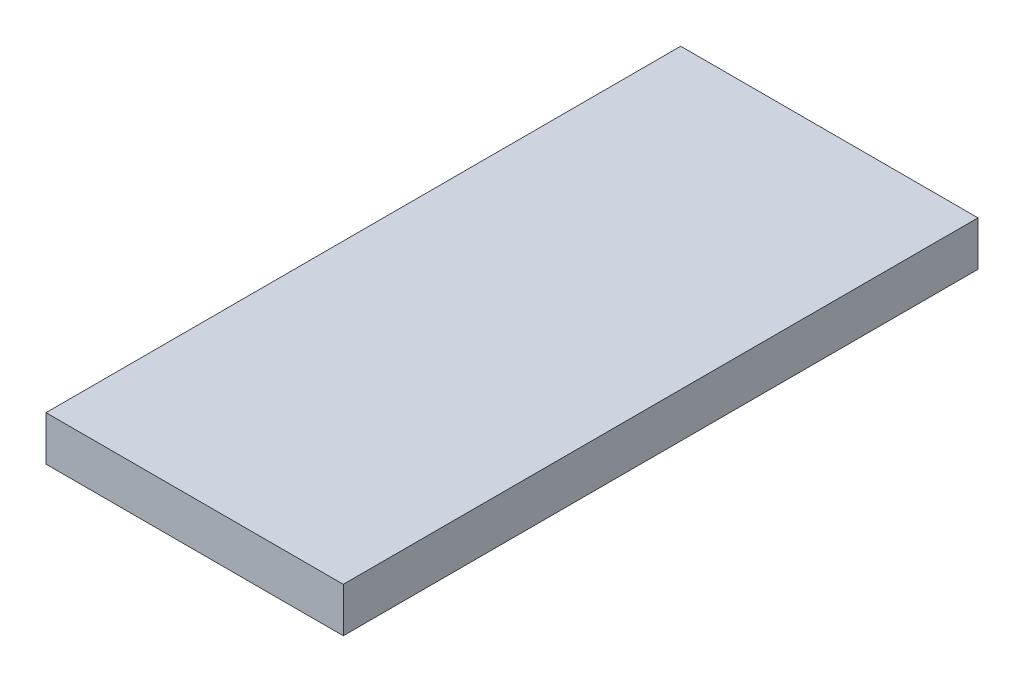
ISO-10303-21;
HEADER;
FILE_DESCRIPTION(('STEP AP214'),'2;1');
FILE_NAME('part.step','',(''),(''),'','','');
FILE_SCHEMA(('AUTOMOTIVE_DESIGN { 1 0 10303 214 1 1 1 1 }'));
ENDSEC;
DATA;
#1=APPLICATION_CONTEXT('core data for automotive mechanical design processes');
#2=APPLICATION_PROTOCOL_DEFINITION('international standard','automotive_design',2000,#1);
#3=PRODUCT_CONTEXT('',#1,'mechanical');
#4=PRODUCT('Part','Part','',(#3));
#5=PRODUCT_RELATED_PRODUCT_CATEGORY('part','',(#4));
#6=PRODUCT_DEFINITION_FORMATION('','',#4);
#7=PRODUCT_DEFINITION_CONTEXT('part definition',#1,'design');
#8=PRODUCT_DEFINITION('design','',#6,#7);
#9=PRODUCT_DEFINITION_SHAPE('','',#8);
#10=(LENGTH_UNIT() NAMED_UNIT(*) SI_UNIT(.MILLI.,.METRE.));
#11=(NAMED_UNIT(*) PLANE_ANGLE_UNIT() SI_UNIT($,.RADIAN.));
#12=(NAMED_UNIT(*) SI_UNIT($,.STERADIAN.) SOLID_ANGLE_UNIT());
#13=UNCERTAINTY_MEASURE_WITH_UNIT(LENGTH_MEASURE(1.E-05),#10,'distance_accuracy_value','');
#14=(GEOMETRIC_REPRESENTATION_CONTEXT(3) GLOBAL_UNCERTAINTY_ASSIGNED_CONTEXT((#13)) GLOBAL_UNIT_ASSIGNED_CONTEXT((#10,
#11,#12)) REPRESENTATION_CONTEXT('',''));
#15=CARTESIAN_POINT('',(0.,0.,0.));
#16=DIRECTION('',(0.,0.,1.));
#17=DIRECTION('',(1.,0.,0.));
#18=AXIS2_PLACEMENT_3D('',#15,#16,#17);
#19=CARTESIAN_POINT('',(50.,-7.5,213.5));
#20=DIRECTION('',(-1.,0.,0.));
#21=DIRECTION('',(0.,0.,1.));
#22=AXIS2_PLACEMENT_3D('',#19,#20,#21);
#23=PLANE('',#22);
#24=DIRECTION('',(0.,1.,0.));
#25=VECTOR('',#24,1.);
#26=CARTESIAN_POINT('',(50.,-7.5,0.));
#27=LINE('',#26,#25);
#28=CARTESIAN_POINT('',(50.,-7.5,0.));
#29=VERTEX_POINT('',#28);
#30=CARTESIAN_POINT('',(50.,7.5,0.));
#31=VERTEX_POINT('',#30);
#32=EDGE_CURVE('E78',#29,#31,#27,.T.);
#33=ORIENTED_EDGE('',*,*,#32,.T.);
#34=DIRECTION('',(0.,0.,-1.));
#35=VECTOR('',#34,1.);
#36=CARTESIAN_POINT('',(50.,7.5,213.5));
#37=LINE('',#36,#35);
#38=CARTESIAN_POINT('',(50.,7.5,213.5));
#39=VERTEX_POINT('',#38);
#40=EDGE_CURVE('E11',#39,#31,#37,.T.);
#41=ORIENTED_EDGE('',*,*,#40,.F.);
#42=DIRECTION('',(0.,1.,0.));
#43=VECTOR('',#42,1.);
#44=CARTESIAN_POINT('',(50.,-7.5,213.5));
#45=LINE('',#44,#43);
#46=CARTESIAN_POINT('',(50.,-7.5,213.5));
#47=VERTEX_POINT('',#46);
#48=EDGE_CURVE('E70',#47,#39,#45,.T.);
#49=ORIENTED_EDGE('',*,*,#48,.F.);
#50=DIRECTION('',(0.,0.,-1.));
#51=VECTOR('',#50,1.);
#52=CARTESIAN_POINT('',(50.,-7.5,213.5));
#53=LINE('',#52,#51);
#54=EDGE_CURVE('E74',#47,#29,#53,.T.);
#55=ORIENTED_EDGE('',*,*,#54,.T.);
#56=EDGE_LOOP('',(#33,#41,#49,#55));
#57=FACE_BOUND('',#56,.T.);
#58=ADVANCED_FACE('F16',(#57),#23,.F.);
#59=CARTESIAN_POINT('',(-50.,7.5,213.5));
#60=DIRECTION('',(0.,-1.,0.));
#61=DIRECTION('',(0.,0.,-1.));
#62=AXIS2_PLACEMENT_3D('',#59,#60,#61);
#63=PLANE('',#62);
#64=DIRECTION('',(-1.,0.,0.));
#65=VECTOR('',#64,1.);
#66=CARTESIAN_POINT('',(-50.,7.5,0.));
#67=LINE('',#66,#65);
#68=CARTESIAN_POINT('',(-50.,7.5,0.));
#69=VERTEX_POINT('',#68);
#70=EDGE_CURVE('E75',#31,#69,#67,.T.);
#71=ORIENTED_EDGE('',*,*,#70,.T.);
#72=DIRECTION('',(0.,0.,-1.));
#73=VECTOR('',#72,1.);
#74=CARTESIAN_POINT('',(-50.,7.5,213.5));
#75=LINE('',#74,#73);
#76=CARTESIAN_POINT('',(-50.,7.5,213.5));
#77=VERTEX_POINT('',#76);
#78=EDGE_CURVE('E24',#77,#69,#75,.T.);
#79=ORIENTED_EDGE('',*,*,#78,.F.);
#80=DIRECTION('',(-1.,0.,0.));
#81=VECTOR('',#80,1.);
#82=CARTESIAN_POINT('',(-50.,7.5,213.5));
#83=LINE('',#82,#81);
#84=EDGE_CURVE('E62',#39,#77,#83,.T.);
#85=ORIENTED_EDGE('',*,*,#84,.F.);
#86=ORIENTED_EDGE('',*,*,#40,.T.);
#87=EDGE_LOOP('',(#71,#79,#85,#86));
#88=FACE_BOUND('',#87,.T.);
#89=ADVANCED_FACE('F69',(#88),#63,.F.);
#90=CARTESIAN_POINT('',(-50.,-7.5,213.5));
#91=DIRECTION('',(1.,0.,0.));
#92=DIRECTION('',(0.,0.,-1.));
#93=AXIS2_PLACEMENT_3D('',#90,#91,#92);
#94=PLANE('',#93);
#95=DIRECTION('',(0.,-1.,0.));
#96=VECTOR('',#95,1.);
#97=CARTESIAN_POINT('',(-50.,-7.5,0.));
#98=LINE('',#97,#96);
#99=CARTESIAN_POINT('',(-50.,-7.5,0.));
#100=VERTEX_POINT('',#99);
#101=EDGE_CURVE('E47',#69,#100,#98,.T.);
#102=ORIENTED_EDGE('',*,*,#101,.T.);
#103=DIRECTION('',(0.,0.,-1.));
#104=VECTOR('',#103,1.);
#105=CARTESIAN_POINT('',(-50.,-7.5,213.5));
#106=LINE('',#105,#104);
#107=CARTESIAN_POINT('',(-50.,-7.5,213.5));
#108=VERTEX_POINT('',#107);
#109=EDGE_CURVE('E71',#108,#100,#106,.T.);
#110=ORIENTED_EDGE('',*,*,#109,.F.);
#111=DIRECTION('',(0.,-1.,0.));
#112=VECTOR('',#111,1.);
#113=CARTESIAN_POINT('',(-50.,-7.5,213.5));
#114=LINE('',#113,#112);
#115=EDGE_CURVE('E65',#77,#108,#114,.T.);
#116=ORIENTED_EDGE('',*,*,#115,.F.);
#117=ORIENTED_EDGE('',*,*,#78,.T.);
#118=EDGE_LOOP('',(#102,#110,#116,#117));
#119=FACE_BOUND('',#118,.T.);
#120=ADVANCED_FACE('F73',(#119),#94,.F.);
#121=CARTESIAN_POINT('',(-50.,-7.5,213.5));
#122=DIRECTION('',(0.,1.,0.));
#123=DIRECTION('',(-1.,0.,0.));
#124=AXIS2_PLACEMENT_3D('',#121,#122,#123);
#125=PLANE('',#124);
#126=DIRECTION('',(1.,0.,0.));
#127=VECTOR('',#126,1.);
#128=CARTESIAN_POINT('',(-50.,-7.5,0.));
#129=LINE('',#128,#127);
#130=EDGE_CURVE('E54',#100,#29,#129,.T.);
#131=ORIENTED_EDGE('',*,*,#130,.T.);
#132=ORIENTED_EDGE('',*,*,#54,.F.);
#133=DIRECTION('',(1.,0.,0.));
#134=VECTOR('',#133,1.);
#135=CARTESIAN_POINT('',(-50.,-7.5,213.5));
#136=LINE('',#135,#134);
#137=EDGE_CURVE('E32',#108,#47,#136,.T.);
#138=ORIENTED_EDGE('',*,*,#137,.F.);
#139=ORIENTED_EDGE('',*,*,#109,.T.);
#140=EDGE_LOOP('',(#131,#132,#138,#139));
#141=FACE_BOUND('',#140,.T.);
#142=ADVANCED_FACE('F88',(#141),#125,.F.);
#143=CARTESIAN_POINT('',(0.,0.,213.5));
#144=DIRECTION('',(0.,0.,-1.));
#145=DIRECTION('',(-1.,0.,0.));
#146=AXIS2_PLACEMENT_3D('',#143,#144,#145);
#147=PLANE('',#146);
#148=ORIENTED_EDGE('',*,*,#48,.T.);
#149=ORIENTED_EDGE('',*,*,#84,.T.);
#150=ORIENTED_EDGE('',*,*,#115,.T.);
#151=ORIENTED_EDGE('',*,*,#137,.T.);
#152=EDGE_LOOP('',(#148,#149,#150,#151));
#153=FACE_BOUND('',#152,.T.);
#154=ADVANCED_FACE('F64',(#153),#147,.F.);
#155=CARTESIAN_POINT('',(0.,0.,0.));
#156=DIRECTION('',(0.,0.,-1.));
#157=DIRECTION('',(-1.,0.,0.));
#158=AXIS2_PLACEMENT_3D('',#155,#156,#157);
#159=PLANE('',#158);
#160=ORIENTED_EDGE('',*,*,#32,.F.);
#161=ORIENTED_EDGE('',*,*,#130,.F.);
#162=ORIENTED_EDGE('',*,*,#101,.F.);
#163=ORIENTED_EDGE('',*,*,#70,.F.);
#164=EDGE_LOOP('',(#160,#161,#162,#163));
#165=FACE_BOUND('',#164,.T.);
#166=ADVANCED_FACE('F90',(#165),#159,.T.);
#167=CLOSED_SHELL('',(#58,#89,#120,#142,#154,#166));
#168=MANIFOLD_SOLID_BREP('B1',#167);
#169=ADVANCED_BREP_SHAPE_REPRESENTATION('',(#18,#168),#14);
#170=SHAPE_DEFINITION_REPRESENTATION(#9,#169);
ENDSEC;
END-ISO-10303-21;
